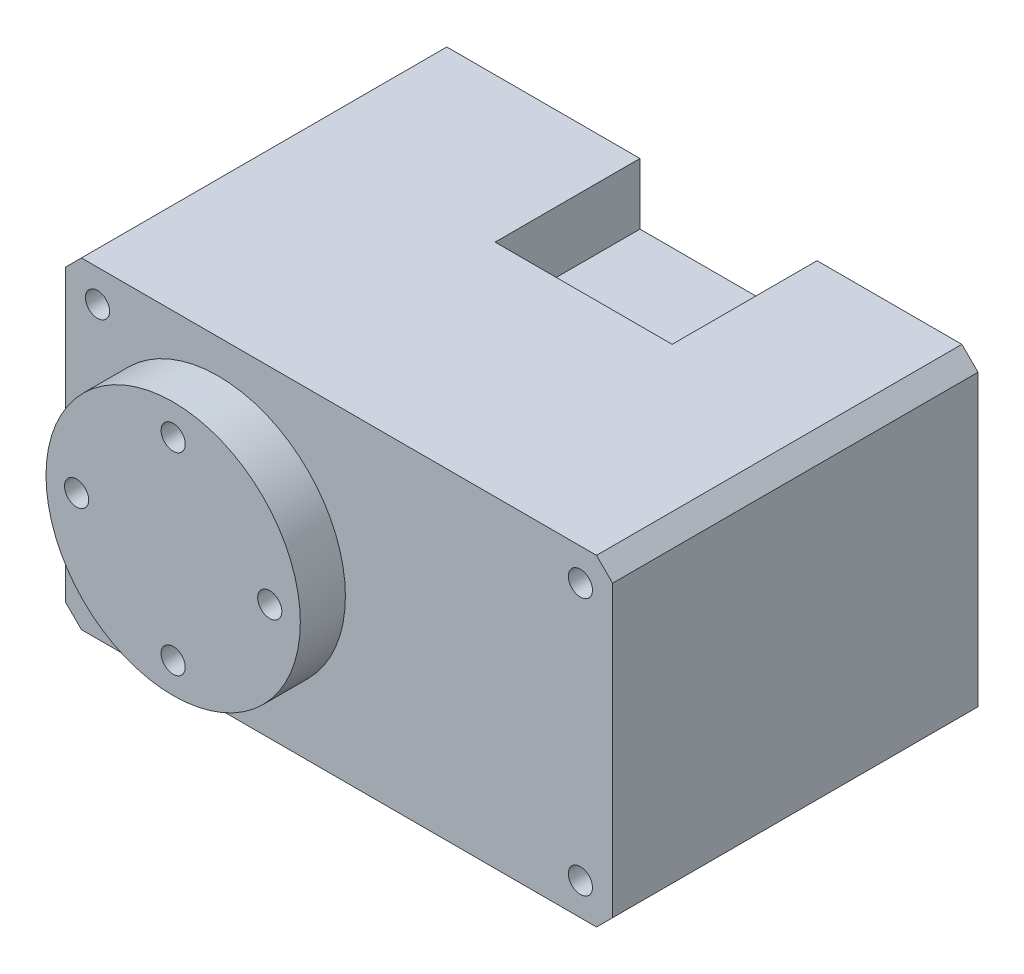
ISO-10303-21;
HEADER;
FILE_DESCRIPTION(('STEP AP214'),'2;1');
FILE_NAME('part.step','',(''),(''),'','','');
FILE_SCHEMA(('AUTOMOTIVE_DESIGN { 1 0 10303 214 1 1 1 1 }'));
ENDSEC;
DATA;
#1=APPLICATION_CONTEXT('core data for automotive mechanical design processes');
#2=APPLICATION_PROTOCOL_DEFINITION('international standard','automotive_design',2000,#1);
#3=PRODUCT_CONTEXT('',#1,'mechanical');
#4=PRODUCT('Part','Part','',(#3));
#5=PRODUCT_RELATED_PRODUCT_CATEGORY('part','',(#4));
#6=PRODUCT_DEFINITION_FORMATION('','',#4);
#7=PRODUCT_DEFINITION_CONTEXT('part definition',#1,'design');
#8=PRODUCT_DEFINITION('design','',#6,#7);
#9=PRODUCT_DEFINITION_SHAPE('','',#8);
#10=(LENGTH_UNIT() NAMED_UNIT(*) SI_UNIT(.MILLI.,.METRE.));
#11=(NAMED_UNIT(*) PLANE_ANGLE_UNIT() SI_UNIT($,.RADIAN.));
#12=(NAMED_UNIT(*) SI_UNIT($,.STERADIAN.) SOLID_ANGLE_UNIT());
#13=UNCERTAINTY_MEASURE_WITH_UNIT(LENGTH_MEASURE(1.E-05),#10,'distance_accuracy_value','');
#14=(GEOMETRIC_REPRESENTATION_CONTEXT(3) GLOBAL_UNCERTAINTY_ASSIGNED_CONTEXT((#13)) GLOBAL_UNIT_ASSIGNED_CONTEXT((#10,
#11,#12)) REPRESENTATION_CONTEXT('',''));
#15=CARTESIAN_POINT('',(0.,0.,0.));
#16=DIRECTION('',(0.,0.,1.));
#17=DIRECTION('',(1.,0.,0.));
#18=AXIS2_PLACEMENT_3D('',#15,#16,#17);
#19=CARTESIAN_POINT('',(0.,0.,19.5));
#20=DIRECTION('',(0.,0.,1.));
#21=DIRECTION('',(1.,0.,0.));
#22=AXIS2_PLACEMENT_3D('',#19,#20,#21);
#23=PLANE('',#22);
#24=CARTESIAN_POINT('',(-7.5,6.,19.5));
#25=DIRECTION('',(0.,0.,1.));
#26=DIRECTION('',(1.,0.,0.));
#27=AXIS2_PLACEMENT_3D('',#24,#25,#26);
#28=CIRCLE('',#27,0.75);
#29=CARTESIAN_POINT('',(-6.75,6.,19.5));
#30=VERTEX_POINT('',#29);
#31=EDGE_CURVE('E334',#30,#30,#28,.T.);
#32=ORIENTED_EDGE('',*,*,#31,.T.);
#33=EDGE_LOOP('',(#32));
#34=FACE_BOUND('',#33,.T.);
#35=ADVANCED_FACE('F38',(#34),#23,.T.);
#36=CARTESIAN_POINT('',(-7.5,7.5,19.5));
#37=DIRECTION('',(0.,0.,1.));
#38=DIRECTION('',(1.,0.,0.));
#39=AXIS2_PLACEMENT_3D('',#36,#37,#38);
#40=PLANE('',#39);
#41=CARTESIAN_POINT('',(-13.5,0.,19.5));
#42=DIRECTION('',(0.,0.,1.));
#43=DIRECTION('',(1.,0.,0.));
#44=AXIS2_PLACEMENT_3D('',#41,#42,#43);
#45=CIRCLE('',#44,0.75);
#46=CARTESIAN_POINT('',(-12.75,0.,19.5));
#47=VERTEX_POINT('',#46);
#48=EDGE_CURVE('E331',#47,#47,#45,.T.);
#49=ORIENTED_EDGE('',*,*,#48,.T.);
#50=EDGE_LOOP('',(#49));
#51=FACE_BOUND('',#50,.T.);
#52=ADVANCED_FACE('F573',(#51),#40,.T.);
#53=CARTESIAN_POINT('',(-15.,0.,19.5));
#54=DIRECTION('',(0.,0.,1.));
#55=DIRECTION('',(1.,0.,0.));
#56=AXIS2_PLACEMENT_3D('',#53,#54,#55);
#57=PLANE('',#56);
#58=CARTESIAN_POINT('',(-7.5,-6.,19.5));
#59=DIRECTION('',(0.,0.,1.));
#60=DIRECTION('',(1.,0.,0.));
#61=AXIS2_PLACEMENT_3D('',#58,#59,#60);
#62=CIRCLE('',#61,0.75);
#63=CARTESIAN_POINT('',(-6.75,-6.,19.5));
#64=VERTEX_POINT('',#63);
#65=EDGE_CURVE('E328',#64,#64,#62,.T.);
#66=ORIENTED_EDGE('',*,*,#65,.T.);
#67=EDGE_LOOP('',(#66));
#68=FACE_BOUND('',#67,.T.);
#69=ADVANCED_FACE('F577',(#68),#57,.T.);
#70=CARTESIAN_POINT('',(-7.5,-7.5,19.5));
#71=DIRECTION('',(0.,0.,1.));
#72=DIRECTION('',(1.,0.,0.));
#73=AXIS2_PLACEMENT_3D('',#70,#71,#72);
#74=PLANE('',#73);
#75=CARTESIAN_POINT('',(-1.5,0.,19.5));
#76=DIRECTION('',(0.,0.,1.));
#77=DIRECTION('',(1.,0.,0.));
#78=AXIS2_PLACEMENT_3D('',#75,#76,#77);
#79=CIRCLE('',#78,0.75);
#80=CARTESIAN_POINT('',(-0.75,0.,19.5));
#81=VERTEX_POINT('',#80);
#82=EDGE_CURVE('E325',#81,#81,#79,.T.);
#83=ORIENTED_EDGE('',*,*,#82,.T.);
#84=EDGE_LOOP('',(#83));
#85=FACE_BOUND('',#84,.T.);
#86=ADVANCED_FACE('F581',(#85),#74,.T.);
#87=CARTESIAN_POINT('',(-7.5,6.,25.5));
#88=DIRECTION('',(0.,0.,1.));
#89=DIRECTION('',(1.,0.,0.));
#90=AXIS2_PLACEMENT_3D('',#87,#88,#89);
#91=CYLINDRICAL_SURFACE('',#90,0.75);
#92=ORIENTED_EDGE('',*,*,#31,.F.);
#93=EDGE_LOOP('',(#92));
#94=FACE_BOUND('',#93,.T.);
#95=CARTESIAN_POINT('',(-7.5,6.,25.5));
#96=DIRECTION('',(0.,0.,1.));
#97=DIRECTION('',(1.,0.,0.));
#98=AXIS2_PLACEMENT_3D('',#95,#96,#97);
#99=CIRCLE('',#98,0.75);
#100=CARTESIAN_POINT('',(-6.75,6.,25.5));
#101=VERTEX_POINT('',#100);
#102=EDGE_CURVE('E322',#101,#101,#99,.F.);
#103=ORIENTED_EDGE('',*,*,#102,.F.);
#104=EDGE_LOOP('',(#103));
#105=FACE_BOUND('',#104,.T.);
#106=ADVANCED_FACE('F585',(#94,#105),#91,.F.);
#107=CARTESIAN_POINT('',(-13.5,0.,25.5));
#108=DIRECTION('',(0.,0.,1.));
#109=DIRECTION('',(1.,0.,0.));
#110=AXIS2_PLACEMENT_3D('',#107,#108,#109);
#111=CYLINDRICAL_SURFACE('',#110,0.75);
#112=ORIENTED_EDGE('',*,*,#48,.F.);
#113=EDGE_LOOP('',(#112));
#114=FACE_BOUND('',#113,.T.);
#115=CARTESIAN_POINT('',(-13.5,0.,25.5));
#116=DIRECTION('',(0.,0.,1.));
#117=DIRECTION('',(1.,0.,0.));
#118=AXIS2_PLACEMENT_3D('',#115,#116,#117);
#119=CIRCLE('',#118,0.75);
#120=CARTESIAN_POINT('',(-12.75,0.,25.5));
#121=VERTEX_POINT('',#120);
#122=EDGE_CURVE('E319',#121,#121,#119,.F.);
#123=ORIENTED_EDGE('',*,*,#122,.F.);
#124=EDGE_LOOP('',(#123));
#125=FACE_BOUND('',#124,.T.);
#126=ADVANCED_FACE('F589',(#114,#125),#111,.F.);
#127=CARTESIAN_POINT('',(-7.5,-6.,25.5));
#128=DIRECTION('',(0.,0.,1.));
#129=DIRECTION('',(1.,0.,0.));
#130=AXIS2_PLACEMENT_3D('',#127,#128,#129);
#131=CYLINDRICAL_SURFACE('',#130,0.75);
#132=ORIENTED_EDGE('',*,*,#65,.F.);
#133=EDGE_LOOP('',(#132));
#134=FACE_BOUND('',#133,.T.);
#135=CARTESIAN_POINT('',(-7.5,-6.,25.5));
#136=DIRECTION('',(0.,0.,1.));
#137=DIRECTION('',(1.,0.,0.));
#138=AXIS2_PLACEMENT_3D('',#135,#136,#137);
#139=CIRCLE('',#138,0.75);
#140=CARTESIAN_POINT('',(-6.75,-6.,25.5));
#141=VERTEX_POINT('',#140);
#142=EDGE_CURVE('E316',#141,#141,#139,.F.);
#143=ORIENTED_EDGE('',*,*,#142,.F.);
#144=EDGE_LOOP('',(#143));
#145=FACE_BOUND('',#144,.T.);
#146=ADVANCED_FACE('F593',(#134,#145),#131,.F.);
#147=CARTESIAN_POINT('',(-1.5,0.,25.5));
#148=DIRECTION('',(0.,0.,1.));
#149=DIRECTION('',(1.,0.,0.));
#150=AXIS2_PLACEMENT_3D('',#147,#148,#149);
#151=CYLINDRICAL_SURFACE('',#150,0.75);
#152=ORIENTED_EDGE('',*,*,#82,.F.);
#153=EDGE_LOOP('',(#152));
#154=FACE_BOUND('',#153,.T.);
#155=CARTESIAN_POINT('',(-1.5,0.,25.5));
#156=DIRECTION('',(0.,0.,1.));
#157=DIRECTION('',(1.,0.,0.));
#158=AXIS2_PLACEMENT_3D('',#155,#156,#157);
#159=CIRCLE('',#158,0.75);
#160=CARTESIAN_POINT('',(-0.75,0.,25.5));
#161=VERTEX_POINT('',#160);
#162=EDGE_CURVE('E313',#161,#161,#159,.F.);
#163=ORIENTED_EDGE('',*,*,#162,.F.);
#164=EDGE_LOOP('',(#163));
#165=FACE_BOUND('',#164,.T.);
#166=ADVANCED_FACE('F597',(#154,#165),#151,.F.);
#167=CARTESIAN_POINT('',(0.,0.,25.5));
#168=DIRECTION('',(0.,0.,1.));
#169=DIRECTION('',(1.,0.,0.));
#170=AXIS2_PLACEMENT_3D('',#167,#168,#169);
#171=PLANE('',#170);
#172=ORIENTED_EDGE('',*,*,#162,.T.);
#173=EDGE_LOOP('',(#172));
#174=FACE_BOUND('',#173,.T.);
#175=ORIENTED_EDGE('',*,*,#142,.T.);
#176=EDGE_LOOP('',(#175));
#177=FACE_BOUND('',#176,.T.);
#178=ORIENTED_EDGE('',*,*,#122,.T.);
#179=EDGE_LOOP('',(#178));
#180=FACE_BOUND('',#179,.T.);
#181=ORIENTED_EDGE('',*,*,#102,.T.);
#182=EDGE_LOOP('',(#181));
#183=FACE_BOUND('',#182,.T.);
#184=CARTESIAN_POINT('',(-7.5,0.,25.5));
#185=DIRECTION('',(0.,0.,1.));
#186=DIRECTION('',(1.,0.,0.));
#187=AXIS2_PLACEMENT_3D('',#184,#185,#186);
#188=CIRCLE('',#187,7.9);
#189=CARTESIAN_POINT('',(0.400000000000001,0.,25.5));
#190=VERTEX_POINT('',#189);
#191=EDGE_CURVE('E310',#190,#190,#188,.F.);
#192=ORIENTED_EDGE('',*,*,#191,.F.);
#193=EDGE_LOOP('',(#192));
#194=FACE_BOUND('',#193,.T.);
#195=ADVANCED_FACE('F601',(#174,#177,#180,#183,#194),#171,.T.);
#196=CARTESIAN_POINT('',(0.,0.,14.7));
#197=DIRECTION('',(0.,0.,1.));
#198=DIRECTION('',(1.,0.,0.));
#199=AXIS2_PLACEMENT_3D('',#196,#197,#198);
#200=PLANE('',#199);
#201=CARTESIAN_POINT('',(-15.,8.,14.7));
#202=DIRECTION('',(0.,0.,1.));
#203=DIRECTION('',(1.,0.,0.));
#204=AXIS2_PLACEMENT_3D('',#201,#202,#203);
#205=CIRCLE('',#204,0.75);
#206=CARTESIAN_POINT('',(-14.25,8.,14.7));
#207=VERTEX_POINT('',#206);
#208=EDGE_CURVE('E307',#207,#207,#205,.T.);
#209=ORIENTED_EDGE('',*,*,#208,.T.);
#210=EDGE_LOOP('',(#209));
#211=FACE_BOUND('',#210,.T.);
#212=ADVANCED_FACE('F605',(#211),#200,.T.);
#213=CARTESIAN_POINT('',(0.,0.,14.7));
#214=DIRECTION('',(0.,0.,1.));
#215=DIRECTION('',(1.,0.,0.));
#216=AXIS2_PLACEMENT_3D('',#213,#214,#215);
#217=PLANE('',#216);
#218=CARTESIAN_POINT('',(-15.,-8.,14.7));
#219=DIRECTION('',(0.,0.,1.));
#220=DIRECTION('',(1.,0.,0.));
#221=AXIS2_PLACEMENT_3D('',#218,#219,#220);
#222=CIRCLE('',#221,0.75);
#223=CARTESIAN_POINT('',(-14.25,-8.,14.7));
#224=VERTEX_POINT('',#223);
#225=EDGE_CURVE('E304',#224,#224,#222,.T.);
#226=ORIENTED_EDGE('',*,*,#225,.T.);
#227=EDGE_LOOP('',(#226));
#228=FACE_BOUND('',#227,.T.);
#229=ADVANCED_FACE('F609',(#228),#217,.T.);
#230=CARTESIAN_POINT('',(0.,0.,14.7));
#231=DIRECTION('',(0.,0.,1.));
#232=DIRECTION('',(1.,0.,0.));
#233=AXIS2_PLACEMENT_3D('',#230,#231,#232);
#234=PLANE('',#233);
#235=CARTESIAN_POINT('',(15.,8.,14.7));
#236=DIRECTION('',(0.,0.,1.));
#237=DIRECTION('',(1.,0.,0.));
#238=AXIS2_PLACEMENT_3D('',#235,#236,#237);
#239=CIRCLE('',#238,0.75);
#240=CARTESIAN_POINT('',(15.75,8.,14.7));
#241=VERTEX_POINT('',#240);
#242=EDGE_CURVE('E301',#241,#241,#239,.T.);
#243=ORIENTED_EDGE('',*,*,#242,.T.);
#244=EDGE_LOOP('',(#243));
#245=FACE_BOUND('',#244,.T.);
#246=ADVANCED_FACE('F613',(#245),#234,.T.);
#247=CARTESIAN_POINT('',(0.,0.,14.7));
#248=DIRECTION('',(0.,0.,1.));
#249=DIRECTION('',(1.,0.,0.));
#250=AXIS2_PLACEMENT_3D('',#247,#248,#249);
#251=PLANE('',#250);
#252=CARTESIAN_POINT('',(15.,-8.,14.7));
#253=DIRECTION('',(0.,0.,1.));
#254=DIRECTION('',(1.,0.,0.));
#255=AXIS2_PLACEMENT_3D('',#252,#253,#254);
#256=CIRCLE('',#255,0.75);
#257=CARTESIAN_POINT('',(15.75,-8.,14.7));
#258=VERTEX_POINT('',#257);
#259=EDGE_CURVE('E265',#258,#258,#256,.T.);
#260=ORIENTED_EDGE('',*,*,#259,.T.);
#261=EDGE_LOOP('',(#260));
#262=FACE_BOUND('',#261,.T.);
#263=ADVANCED_FACE('F617',(#262),#251,.T.);
#264=CARTESIAN_POINT('',(7.,-10.,9.));
#265=DIRECTION('',(0.,0.,1.));
#266=DIRECTION('',(1.,0.,0.));
#267=AXIS2_PLACEMENT_3D('',#264,#265,#266);
#268=PLANE('',#267);
#269=DIRECTION('',(1.,0.,0.));
#270=VECTOR('',#269,1.);
#271=CARTESIAN_POINT('',(0.,-6.2,9.));
#272=LINE('',#271,#270);
#273=CARTESIAN_POINT('',(7.,-6.2,9.));
#274=VERTEX_POINT('',#273);
#275=CARTESIAN_POINT('',(-4.,-6.2,9.));
#276=VERTEX_POINT('',#275);
#277=EDGE_CURVE('E260',#274,#276,#272,.F.);
#278=ORIENTED_EDGE('',*,*,#277,.F.);
#279=DIRECTION('',(0.,1.,0.));
#280=VECTOR('',#279,1.);
#281=CARTESIAN_POINT('',(7.,-10.,9.));
#282=LINE('',#281,#280);
#283=CARTESIAN_POINT('',(7.,-10.,9.));
#284=VERTEX_POINT('',#283);
#285=EDGE_CURVE('E252',#274,#284,#282,.F.);
#286=ORIENTED_EDGE('',*,*,#285,.T.);
#287=DIRECTION('',(1.,0.,0.));
#288=VECTOR('',#287,1.);
#289=CARTESIAN_POINT('',(-17.,-10.,9.));
#290=LINE('',#289,#288);
#291=CARTESIAN_POINT('',(-4.,-10.,9.));
#292=VERTEX_POINT('',#291);
#293=EDGE_CURVE('E246',#292,#284,#290,.T.);
#294=ORIENTED_EDGE('',*,*,#293,.F.);
#295=DIRECTION('',(0.,1.,0.));
#296=VECTOR('',#295,1.);
#297=CARTESIAN_POINT('',(-4.,-10.,9.));
#298=LINE('',#297,#296);
#299=EDGE_CURVE('E263',#292,#276,#298,.T.);
#300=ORIENTED_EDGE('',*,*,#299,.T.);
#301=EDGE_LOOP('',(#278,#286,#294,#300));
#302=FACE_BOUND('',#301,.T.);
#303=ADVANCED_FACE('F621',(#302),#268,.F.);
#304=CARTESIAN_POINT('',(0.,0.,6.));
#305=DIRECTION('',(0.,0.,-1.));
#306=DIRECTION('',(-1.,0.,0.));
#307=AXIS2_PLACEMENT_3D('',#304,#305,#306);
#308=PLANE('',#307);
#309=CARTESIAN_POINT('',(-15.,8.,6.));
#310=DIRECTION('',(0.,0.,-1.));
#311=DIRECTION('',(-1.,0.,0.));
#312=AXIS2_PLACEMENT_3D('',#309,#310,#311);
#313=CIRCLE('',#312,0.75);
#314=CARTESIAN_POINT('',(-15.75,8.,6.));
#315=VERTEX_POINT('',#314);
#316=EDGE_CURVE('E245',#315,#315,#313,.T.);
#317=ORIENTED_EDGE('',*,*,#316,.T.);
#318=EDGE_LOOP('',(#317));
#319=FACE_BOUND('',#318,.T.);
#320=ADVANCED_FACE('F625',(#319),#308,.T.);
#321=CARTESIAN_POINT('',(0.,0.,6.));
#322=DIRECTION('',(0.,0.,-1.));
#323=DIRECTION('',(-1.,0.,0.));
#324=AXIS2_PLACEMENT_3D('',#321,#322,#323);
#325=PLANE('',#324);
#326=CARTESIAN_POINT('',(15.,8.,6.));
#327=DIRECTION('',(0.,0.,-1.));
#328=DIRECTION('',(-1.,0.,0.));
#329=AXIS2_PLACEMENT_3D('',#326,#327,#328);
#330=CIRCLE('',#329,0.75);
#331=CARTESIAN_POINT('',(14.25,8.,6.));
#332=VERTEX_POINT('',#331);
#333=EDGE_CURVE('E294',#332,#332,#330,.T.);
#334=ORIENTED_EDGE('',*,*,#333,.T.);
#335=EDGE_LOOP('',(#334));
#336=FACE_BOUND('',#335,.T.);
#337=ADVANCED_FACE('F629',(#336),#325,.T.);
#338=CARTESIAN_POINT('',(0.,0.,6.));
#339=DIRECTION('',(0.,0.,-1.));
#340=DIRECTION('',(-1.,0.,0.));
#341=AXIS2_PLACEMENT_3D('',#338,#339,#340);
#342=PLANE('',#341);
#343=CARTESIAN_POINT('',(15.,-8.,6.));
#344=DIRECTION('',(0.,0.,-1.));
#345=DIRECTION('',(-1.,0.,0.));
#346=AXIS2_PLACEMENT_3D('',#343,#344,#345);
#347=CIRCLE('',#346,0.75);
#348=CARTESIAN_POINT('',(14.25,-8.,6.));
#349=VERTEX_POINT('',#348);
#350=EDGE_CURVE('E291',#349,#349,#347,.T.);
#351=ORIENTED_EDGE('',*,*,#350,.T.);
#352=EDGE_LOOP('',(#351));
#353=FACE_BOUND('',#352,.T.);
#354=ADVANCED_FACE('F633',(#353),#342,.T.);
#355=CARTESIAN_POINT('',(0.,0.,6.));
#356=DIRECTION('',(0.,0.,-1.));
#357=DIRECTION('',(-1.,0.,0.));
#358=AXIS2_PLACEMENT_3D('',#355,#356,#357);
#359=PLANE('',#358);
#360=CARTESIAN_POINT('',(-15.,-8.,6.));
#361=DIRECTION('',(0.,0.,-1.));
#362=DIRECTION('',(-1.,0.,0.));
#363=AXIS2_PLACEMENT_3D('',#360,#361,#362);
#364=CIRCLE('',#363,0.75);
#365=CARTESIAN_POINT('',(-15.75,-8.,6.));
#366=VERTEX_POINT('',#365);
#367=EDGE_CURVE('E241',#366,#366,#364,.T.);
#368=ORIENTED_EDGE('',*,*,#367,.T.);
#369=EDGE_LOOP('',(#368));
#370=FACE_BOUND('',#369,.T.);
#371=ADVANCED_FACE('F637',(#370),#359,.T.);
#372=CARTESIAN_POINT('',(-7.5,0.,22.7));
#373=DIRECTION('',(0.,0.,1.));
#374=DIRECTION('',(1.,0.,0.));
#375=AXIS2_PLACEMENT_3D('',#372,#373,#374);
#376=CYLINDRICAL_SURFACE('',#375,7.9);
#377=ORIENTED_EDGE('',*,*,#191,.T.);
#378=EDGE_LOOP('',(#377));
#379=FACE_BOUND('',#378,.T.);
#380=CARTESIAN_POINT('',(-7.5,0.,22.7));
#381=DIRECTION('',(0.,0.,1.));
#382=DIRECTION('',(1.,0.,0.));
#383=AXIS2_PLACEMENT_3D('',#380,#381,#382);
#384=CIRCLE('',#383,7.9);
#385=CARTESIAN_POINT('',(0.400000000000001,0.,22.7));
#386=VERTEX_POINT('',#385);
#387=EDGE_CURVE('E229',#386,#386,#384,.F.);
#388=ORIENTED_EDGE('',*,*,#387,.F.);
#389=EDGE_LOOP('',(#388));
#390=FACE_BOUND('',#389,.T.);
#391=ADVANCED_FACE('F641',(#379,#390),#376,.T.);
#392=CARTESIAN_POINT('',(-15.,8.,22.7));
#393=DIRECTION('',(0.,0.,1.));
#394=DIRECTION('',(1.,0.,0.));
#395=AXIS2_PLACEMENT_3D('',#392,#393,#394);
#396=CYLINDRICAL_SURFACE('',#395,0.75);
#397=ORIENTED_EDGE('',*,*,#208,.F.);
#398=EDGE_LOOP('',(#397));
#399=FACE_BOUND('',#398,.T.);
#400=CARTESIAN_POINT('',(-15.,8.,22.7));
#401=DIRECTION('',(0.,0.,1.));
#402=DIRECTION('',(1.,0.,0.));
#403=AXIS2_PLACEMENT_3D('',#400,#401,#402);
#404=CIRCLE('',#403,0.75);
#405=CARTESIAN_POINT('',(-14.25,8.,22.7));
#406=VERTEX_POINT('',#405);
#407=EDGE_CURVE('E284',#406,#406,#404,.F.);
#408=ORIENTED_EDGE('',*,*,#407,.F.);
#409=EDGE_LOOP('',(#408));
#410=FACE_BOUND('',#409,.T.);
#411=ADVANCED_FACE('F645',(#399,#410),#396,.F.);
#412=CARTESIAN_POINT('',(-15.,-8.,22.7));
#413=DIRECTION('',(0.,0.,1.));
#414=DIRECTION('',(1.,0.,0.));
#415=AXIS2_PLACEMENT_3D('',#412,#413,#414);
#416=CYLINDRICAL_SURFACE('',#415,0.75);
#417=ORIENTED_EDGE('',*,*,#225,.F.);
#418=EDGE_LOOP('',(#417));
#419=FACE_BOUND('',#418,.T.);
#420=CARTESIAN_POINT('',(-15.,-8.,22.7));
#421=DIRECTION('',(0.,0.,1.));
#422=DIRECTION('',(1.,0.,0.));
#423=AXIS2_PLACEMENT_3D('',#420,#421,#422);
#424=CIRCLE('',#423,0.75);
#425=CARTESIAN_POINT('',(-14.25,-8.,22.7));
#426=VERTEX_POINT('',#425);
#427=EDGE_CURVE('E281',#426,#426,#424,.F.);
#428=ORIENTED_EDGE('',*,*,#427,.F.);
#429=EDGE_LOOP('',(#428));
#430=FACE_BOUND('',#429,.T.);
#431=ADVANCED_FACE('F649',(#419,#430),#416,.F.);
#432=CARTESIAN_POINT('',(15.,8.,22.7));
#433=DIRECTION('',(0.,0.,1.));
#434=DIRECTION('',(1.,0.,0.));
#435=AXIS2_PLACEMENT_3D('',#432,#433,#434);
#436=CYLINDRICAL_SURFACE('',#435,0.75);
#437=ORIENTED_EDGE('',*,*,#242,.F.);
#438=EDGE_LOOP('',(#437));
#439=FACE_BOUND('',#438,.T.);
#440=CARTESIAN_POINT('',(15.,8.,22.7));
#441=DIRECTION('',(0.,0.,1.));
#442=DIRECTION('',(1.,0.,0.));
#443=AXIS2_PLACEMENT_3D('',#440,#441,#442);
#444=CIRCLE('',#443,0.75);
#445=CARTESIAN_POINT('',(15.75,8.,22.7));
#446=VERTEX_POINT('',#445);
#447=EDGE_CURVE('E278',#446,#446,#444,.F.);
#448=ORIENTED_EDGE('',*,*,#447,.F.);
#449=EDGE_LOOP('',(#448));
#450=FACE_BOUND('',#449,.T.);
#451=ADVANCED_FACE('F653',(#439,#450),#436,.F.);
#452=CARTESIAN_POINT('',(15.,-8.,22.7));
#453=DIRECTION('',(0.,0.,1.));
#454=DIRECTION('',(1.,0.,0.));
#455=AXIS2_PLACEMENT_3D('',#452,#453,#454);
#456=CYLINDRICAL_SURFACE('',#455,0.75);
#457=ORIENTED_EDGE('',*,*,#259,.F.);
#458=EDGE_LOOP('',(#457));
#459=FACE_BOUND('',#458,.T.);
#460=CARTESIAN_POINT('',(15.,-8.,22.7));
#461=DIRECTION('',(0.,0.,1.));
#462=DIRECTION('',(1.,0.,0.));
#463=AXIS2_PLACEMENT_3D('',#460,#461,#462);
#464=CIRCLE('',#463,0.75);
#465=CARTESIAN_POINT('',(15.75,-8.,22.7));
#466=VERTEX_POINT('',#465);
#467=EDGE_CURVE('E225',#466,#466,#464,.F.);
#468=ORIENTED_EDGE('',*,*,#467,.F.);
#469=EDGE_LOOP('',(#468));
#470=FACE_BOUND('',#469,.T.);
#471=ADVANCED_FACE('F657',(#459,#470),#456,.F.);
#472=CARTESIAN_POINT('',(-4.,-10.,9.));
#473=DIRECTION('',(-1.,0.,0.));
#474=DIRECTION('',(0.,0.,1.));
#475=AXIS2_PLACEMENT_3D('',#472,#473,#474);
#476=PLANE('',#475);
#477=ORIENTED_EDGE('',*,*,#299,.F.);
#478=DIRECTION('',(0.,0.,-1.));
#479=VECTOR('',#478,1.);
#480=CARTESIAN_POINT('',(-4.,-10.,0.));
#481=LINE('',#480,#479);
#482=CARTESIAN_POINT('',(-4.,-10.,0.));
#483=VERTEX_POINT('',#482);
#484=EDGE_CURVE('E249',#483,#292,#481,.F.);
#485=ORIENTED_EDGE('',*,*,#484,.F.);
#486=DIRECTION('',(0.,1.,0.));
#487=VECTOR('',#486,1.);
#488=CARTESIAN_POINT('',(-4.,0.,0.));
#489=LINE('',#488,#487);
#490=CARTESIAN_POINT('',(-4.,-6.2,0.));
#491=VERTEX_POINT('',#490);
#492=EDGE_CURVE('E212',#483,#491,#489,.T.);
#493=ORIENTED_EDGE('',*,*,#492,.T.);
#494=DIRECTION('',(0.,0.,-1.));
#495=VECTOR('',#494,1.);
#496=CARTESIAN_POINT('',(-4.,-6.2,0.));
#497=LINE('',#496,#495);
#498=EDGE_CURVE('E257',#276,#491,#497,.T.);
#499=ORIENTED_EDGE('',*,*,#498,.F.);
#500=EDGE_LOOP('',(#477,#485,#493,#499));
#501=FACE_BOUND('',#500,.T.);
#502=ADVANCED_FACE('F396',(#501),#476,.F.);
#503=CARTESIAN_POINT('',(0.,-6.2,0.));
#504=DIRECTION('',(0.,-1.,0.));
#505=DIRECTION('',(0.,0.,-1.));
#506=AXIS2_PLACEMENT_3D('',#503,#504,#505);
#507=PLANE('',#506);
#508=ORIENTED_EDGE('',*,*,#498,.T.);
#509=DIRECTION('',(1.,0.,0.));
#510=VECTOR('',#509,1.);
#511=CARTESIAN_POINT('',(0.,-6.2,0.));
#512=LINE('',#511,#510);
#513=CARTESIAN_POINT('',(7.,-6.2,0.));
#514=VERTEX_POINT('',#513);
#515=EDGE_CURVE('E210',#491,#514,#512,.T.);
#516=ORIENTED_EDGE('',*,*,#515,.T.);
#517=DIRECTION('',(0.,0.,-1.));
#518=VECTOR('',#517,1.);
#519=CARTESIAN_POINT('',(7.,-6.2,0.));
#520=LINE('',#519,#518);
#521=EDGE_CURVE('E254',#514,#274,#520,.F.);
#522=ORIENTED_EDGE('',*,*,#521,.T.);
#523=ORIENTED_EDGE('',*,*,#277,.T.);
#524=EDGE_LOOP('',(#508,#516,#522,#523));
#525=FACE_BOUND('',#524,.T.);
#526=ADVANCED_FACE('F393',(#525),#507,.T.);
#527=CARTESIAN_POINT('',(7.,-10.,0.));
#528=DIRECTION('',(1.,0.,0.));
#529=DIRECTION('',(0.,0.,-1.));
#530=AXIS2_PLACEMENT_3D('',#527,#528,#529);
#531=PLANE('',#530);
#532=ORIENTED_EDGE('',*,*,#285,.F.);
#533=ORIENTED_EDGE('',*,*,#521,.F.);
#534=DIRECTION('',(0.,1.,0.));
#535=VECTOR('',#534,1.);
#536=CARTESIAN_POINT('',(7.,0.,0.));
#537=LINE('',#536,#535);
#538=CARTESIAN_POINT('',(7.,-10.,0.));
#539=VERTEX_POINT('',#538);
#540=EDGE_CURVE('E208',#514,#539,#537,.F.);
#541=ORIENTED_EDGE('',*,*,#540,.T.);
#542=DIRECTION('',(0.,0.,-1.));
#543=VECTOR('',#542,1.);
#544=CARTESIAN_POINT('',(7.,-10.,0.));
#545=LINE('',#544,#543);
#546=EDGE_CURVE('E242',#284,#539,#545,.T.);
#547=ORIENTED_EDGE('',*,*,#546,.F.);
#548=EDGE_LOOP('',(#532,#533,#541,#547));
#549=FACE_BOUND('',#548,.T.);
#550=ADVANCED_FACE('F391',(#549),#531,.F.);
#551=CARTESIAN_POINT('',(-17.,-10.,0.));
#552=DIRECTION('',(0.,-1.,0.));
#553=DIRECTION('',(0.,0.,-1.));
#554=AXIS2_PLACEMENT_3D('',#551,#552,#553);
#555=PLANE('',#554);
#556=DIRECTION('',(1.,0.,0.));
#557=VECTOR('',#556,1.);
#558=CARTESIAN_POINT('',(0.,-10.,22.7));
#559=LINE('',#558,#557);
#560=CARTESIAN_POINT('',(-16.,-10.,22.7));
#561=VERTEX_POINT('',#560);
#562=CARTESIAN_POINT('',(16.,-10.,22.7));
#563=VERTEX_POINT('',#562);
#564=EDGE_CURVE('E230',#561,#563,#559,.T.);
#565=ORIENTED_EDGE('',*,*,#564,.F.);
#566=DIRECTION('',(0.,0.,-1.));
#567=VECTOR('',#566,1.);
#568=CARTESIAN_POINT('',(-16.,-10.,0.));
#569=LINE('',#568,#567);
#570=CARTESIAN_POINT('',(-16.,-10.,0.));
#571=VERTEX_POINT('',#570);
#572=EDGE_CURVE('E55',#561,#571,#569,.T.);
#573=ORIENTED_EDGE('',*,*,#572,.T.);
#574=DIRECTION('',(1.,0.,0.));
#575=VECTOR('',#574,1.);
#576=CARTESIAN_POINT('',(0.,-10.,0.));
#577=LINE('',#576,#575);
#578=EDGE_CURVE('E214',#571,#483,#577,.T.);
#579=ORIENTED_EDGE('',*,*,#578,.T.);
#580=ORIENTED_EDGE('',*,*,#484,.T.);
#581=ORIENTED_EDGE('',*,*,#293,.T.);
#582=ORIENTED_EDGE('',*,*,#546,.T.);
#583=DIRECTION('',(1.,0.,0.));
#584=VECTOR('',#583,1.);
#585=CARTESIAN_POINT('',(0.,-10.,0.));
#586=LINE('',#585,#584);
#587=CARTESIAN_POINT('',(16.,-10.,0.));
#588=VERTEX_POINT('',#587);
#589=EDGE_CURVE('E206',#539,#588,#586,.T.);
#590=ORIENTED_EDGE('',*,*,#589,.T.);
#591=DIRECTION('',(0.,0.,1.));
#592=VECTOR('',#591,1.);
#593=CARTESIAN_POINT('',(16.,-10.,0.));
#594=LINE('',#593,#592);
#595=EDGE_CURVE('E366',#588,#563,#594,.T.);
#596=ORIENTED_EDGE('',*,*,#595,.T.);
#597=EDGE_LOOP('',(#565,#573,#579,#580,#581,#582,#590,#596));
#598=FACE_BOUND('',#597,.T.);
#599=ADVANCED_FACE('F383',(#598),#555,.T.);
#600=CARTESIAN_POINT('',(-15.,8.,0.));
#601=DIRECTION('',(0.,0.,-1.));
#602=DIRECTION('',(-1.,0.,0.));
#603=AXIS2_PLACEMENT_3D('',#600,#601,#602);
#604=CYLINDRICAL_SURFACE('',#603,0.75);
#605=ORIENTED_EDGE('',*,*,#316,.F.);
#606=EDGE_LOOP('',(#605));
#607=FACE_BOUND('',#606,.T.);
#608=CARTESIAN_POINT('',(-15.,8.,0.));
#609=DIRECTION('',(0.,0.,-1.));
#610=DIRECTION('',(-1.,0.,0.));
#611=AXIS2_PLACEMENT_3D('',#608,#609,#610);
#612=CIRCLE('',#611,0.75);
#613=CARTESIAN_POINT('',(-15.75,8.,0.));
#614=VERTEX_POINT('',#613);
#615=EDGE_CURVE('E205',#614,#614,#612,.T.);
#616=ORIENTED_EDGE('',*,*,#615,.T.);
#617=EDGE_LOOP('',(#616));
#618=FACE_BOUND('',#617,.T.);
#619=ADVANCED_FACE('F669',(#607,#618),#604,.F.);
#620=CARTESIAN_POINT('',(15.,8.,0.));
#621=DIRECTION('',(0.,0.,-1.));
#622=DIRECTION('',(-1.,0.,0.));
#623=AXIS2_PLACEMENT_3D('',#620,#621,#622);
#624=CYLINDRICAL_SURFACE('',#623,0.75);
#625=ORIENTED_EDGE('',*,*,#333,.F.);
#626=EDGE_LOOP('',(#625));
#627=FACE_BOUND('',#626,.T.);
#628=CARTESIAN_POINT('',(15.,8.,0.));
#629=DIRECTION('',(0.,0.,-1.));
#630=DIRECTION('',(-1.,0.,0.));
#631=AXIS2_PLACEMENT_3D('',#628,#629,#630);
#632=CIRCLE('',#631,0.75);
#633=CARTESIAN_POINT('',(14.25,8.,0.));
#634=VERTEX_POINT('',#633);
#635=EDGE_CURVE('E271',#634,#634,#632,.T.);
#636=ORIENTED_EDGE('',*,*,#635,.T.);
#637=EDGE_LOOP('',(#636));
#638=FACE_BOUND('',#637,.T.);
#639=ADVANCED_FACE('F672',(#627,#638),#624,.F.);
#640=CARTESIAN_POINT('',(15.,-8.,0.));
#641=DIRECTION('',(0.,0.,-1.));
#642=DIRECTION('',(-1.,0.,0.));
#643=AXIS2_PLACEMENT_3D('',#640,#641,#642);
#644=CYLINDRICAL_SURFACE('',#643,0.75);
#645=ORIENTED_EDGE('',*,*,#350,.F.);
#646=EDGE_LOOP('',(#645));
#647=FACE_BOUND('',#646,.T.);
#648=CARTESIAN_POINT('',(15.,-8.,0.));
#649=DIRECTION('',(0.,0.,-1.));
#650=DIRECTION('',(-1.,0.,0.));
#651=AXIS2_PLACEMENT_3D('',#648,#649,#650);
#652=CIRCLE('',#651,0.75);
#653=CARTESIAN_POINT('',(14.25,-8.,0.));
#654=VERTEX_POINT('',#653);
#655=EDGE_CURVE('E268',#654,#654,#652,.T.);
#656=ORIENTED_EDGE('',*,*,#655,.T.);
#657=EDGE_LOOP('',(#656));
#658=FACE_BOUND('',#657,.T.);
#659=ADVANCED_FACE('F676',(#647,#658),#644,.F.);
#660=CARTESIAN_POINT('',(-15.,-8.,0.));
#661=DIRECTION('',(0.,0.,-1.));
#662=DIRECTION('',(-1.,0.,0.));
#663=AXIS2_PLACEMENT_3D('',#660,#661,#662);
#664=CYLINDRICAL_SURFACE('',#663,0.75);
#665=ORIENTED_EDGE('',*,*,#367,.F.);
#666=EDGE_LOOP('',(#665));
#667=FACE_BOUND('',#666,.T.);
#668=CARTESIAN_POINT('',(-15.,-8.,0.));
#669=DIRECTION('',(0.,0.,-1.));
#670=DIRECTION('',(-1.,0.,0.));
#671=AXIS2_PLACEMENT_3D('',#668,#669,#670);
#672=CIRCLE('',#671,0.75);
#673=CARTESIAN_POINT('',(-15.75,-8.,0.));
#674=VERTEX_POINT('',#673);
#675=EDGE_CURVE('E201',#674,#674,#672,.T.);
#676=ORIENTED_EDGE('',*,*,#675,.T.);
#677=EDGE_LOOP('',(#676));
#678=FACE_BOUND('',#677,.T.);
#679=ADVANCED_FACE('F428',(#667,#678),#664,.F.);
#680=CARTESIAN_POINT('',(0.,6.2,0.));
#681=DIRECTION('',(0.,-1.,0.));
#682=DIRECTION('',(0.,0.,-1.));
#683=AXIS2_PLACEMENT_3D('',#680,#681,#682);
#684=PLANE('',#683);
#685=DIRECTION('',(0.,0.,-1.));
#686=VECTOR('',#685,1.);
#687=CARTESIAN_POINT('',(-4.,6.2,9.));
#688=LINE('',#687,#686);
#689=CARTESIAN_POINT('',(-4.,6.2,9.));
#690=VERTEX_POINT('',#689);
#691=CARTESIAN_POINT('',(-4.,6.2,0.));
#692=VERTEX_POINT('',#691);
#693=EDGE_CURVE('E233',#690,#692,#688,.T.);
#694=ORIENTED_EDGE('',*,*,#693,.F.);
#695=DIRECTION('',(-1.,0.,0.));
#696=VECTOR('',#695,1.);
#697=CARTESIAN_POINT('',(7.,6.2,9.));
#698=LINE('',#697,#696);
#699=CARTESIAN_POINT('',(7.,6.2,9.));
#700=VERTEX_POINT('',#699);
#701=EDGE_CURVE('E239',#700,#690,#698,.T.);
#702=ORIENTED_EDGE('',*,*,#701,.F.);
#703=DIRECTION('',(0.,0.,1.));
#704=VECTOR('',#703,1.);
#705=CARTESIAN_POINT('',(7.,6.2,0.));
#706=LINE('',#705,#704);
#707=CARTESIAN_POINT('',(7.,6.2,0.));
#708=VERTEX_POINT('',#707);
#709=EDGE_CURVE('E176',#708,#700,#706,.T.);
#710=ORIENTED_EDGE('',*,*,#709,.F.);
#711=DIRECTION('',(1.,0.,0.));
#712=VECTOR('',#711,1.);
#713=CARTESIAN_POINT('',(0.,6.2,0.));
#714=LINE('',#713,#712);
#715=EDGE_CURVE('E172',#708,#692,#714,.F.);
#716=ORIENTED_EDGE('',*,*,#715,.T.);
#717=EDGE_LOOP('',(#694,#702,#710,#716));
#718=FACE_BOUND('',#717,.T.);
#719=ADVANCED_FACE('F417',(#718),#684,.F.);
#720=CARTESIAN_POINT('',(7.,10.,9.));
#721=DIRECTION('',(0.,0.,-1.));
#722=DIRECTION('',(-1.,0.,0.));
#723=AXIS2_PLACEMENT_3D('',#720,#721,#722);
#724=PLANE('',#723);
#725=DIRECTION('',(1.,0.,0.));
#726=VECTOR('',#725,1.);
#727=CARTESIAN_POINT('',(17.,10.,9.));
#728=LINE('',#727,#726);
#729=CARTESIAN_POINT('',(7.,10.,9.));
#730=VERTEX_POINT('',#729);
#731=CARTESIAN_POINT('',(-4.,10.,9.));
#732=VERTEX_POINT('',#731);
#733=EDGE_CURVE('E197',#730,#732,#728,.F.);
#734=ORIENTED_EDGE('',*,*,#733,.F.);
#735=DIRECTION('',(0.,1.,0.));
#736=VECTOR('',#735,1.);
#737=CARTESIAN_POINT('',(7.,10.,9.));
#738=LINE('',#737,#736);
#739=EDGE_CURVE('E177',#700,#730,#738,.T.);
#740=ORIENTED_EDGE('',*,*,#739,.F.);
#741=ORIENTED_EDGE('',*,*,#701,.T.);
#742=DIRECTION('',(0.,1.,0.));
#743=VECTOR('',#742,1.);
#744=CARTESIAN_POINT('',(-4.,10.,9.));
#745=LINE('',#744,#743);
#746=EDGE_CURVE('E236',#732,#690,#745,.F.);
#747=ORIENTED_EDGE('',*,*,#746,.F.);
#748=EDGE_LOOP('',(#734,#740,#741,#747));
#749=FACE_BOUND('',#748,.T.);
#750=ADVANCED_FACE('F419',(#749),#724,.T.);
#751=CARTESIAN_POINT('',(-4.,10.,9.));
#752=DIRECTION('',(1.,0.,0.));
#753=DIRECTION('',(0.,0.,-1.));
#754=AXIS2_PLACEMENT_3D('',#751,#752,#753);
#755=PLANE('',#754);
#756=ORIENTED_EDGE('',*,*,#746,.T.);
#757=ORIENTED_EDGE('',*,*,#693,.T.);
#758=DIRECTION('',(0.,1.,0.));
#759=VECTOR('',#758,1.);
#760=CARTESIAN_POINT('',(-4.,0.,0.));
#761=LINE('',#760,#759);
#762=CARTESIAN_POINT('',(-4.,10.,0.));
#763=VERTEX_POINT('',#762);
#764=EDGE_CURVE('E219',#692,#763,#761,.T.);
#765=ORIENTED_EDGE('',*,*,#764,.T.);
#766=DIRECTION('',(0.,0.,1.));
#767=VECTOR('',#766,1.);
#768=CARTESIAN_POINT('',(-4.,10.,0.));
#769=LINE('',#768,#767);
#770=EDGE_CURVE('E194',#732,#763,#769,.F.);
#771=ORIENTED_EDGE('',*,*,#770,.F.);
#772=EDGE_LOOP('',(#756,#757,#765,#771));
#773=FACE_BOUND('',#772,.T.);
#774=ADVANCED_FACE('F414',(#773),#755,.T.);
#775=CARTESIAN_POINT('',(-17.,10.,0.));
#776=DIRECTION('',(-1.,0.,0.));
#777=DIRECTION('',(0.,0.,1.));
#778=AXIS2_PLACEMENT_3D('',#775,#776,#777);
#779=PLANE('',#778);
#780=DIRECTION('',(0.,1.,0.));
#781=VECTOR('',#780,1.);
#782=CARTESIAN_POINT('',(-17.,0.,22.7));
#783=LINE('',#782,#781);
#784=CARTESIAN_POINT('',(-17.,9.,22.7));
#785=VERTEX_POINT('',#784);
#786=CARTESIAN_POINT('',(-17.,-8.99999999999999,22.7));
#787=VERTEX_POINT('',#786);
#788=EDGE_CURVE('E226',#785,#787,#783,.F.);
#789=ORIENTED_EDGE('',*,*,#788,.F.);
#790=DIRECTION('',(0.,0.,-1.));
#791=VECTOR('',#790,1.);
#792=CARTESIAN_POINT('',(-17.,9.,0.));
#793=LINE('',#792,#791);
#794=CARTESIAN_POINT('',(-17.,9.,0.));
#795=VERTEX_POINT('',#794);
#796=EDGE_CURVE('E357',#785,#795,#793,.T.);
#797=ORIENTED_EDGE('',*,*,#796,.T.);
#798=DIRECTION('',(0.,1.,0.));
#799=VECTOR('',#798,1.);
#800=CARTESIAN_POINT('',(-17.,0.,0.));
#801=LINE('',#800,#799);
#802=CARTESIAN_POINT('',(-17.,-8.99999999999999,0.));
#803=VERTEX_POINT('',#802);
#804=EDGE_CURVE('E216',#795,#803,#801,.F.);
#805=ORIENTED_EDGE('',*,*,#804,.T.);
#806=DIRECTION('',(0.,0.,1.));
#807=VECTOR('',#806,1.);
#808=CARTESIAN_POINT('',(-17.,-8.99999999999999,0.));
#809=LINE('',#808,#807);
#810=EDGE_CURVE('E354',#803,#787,#809,.T.);
#811=ORIENTED_EDGE('',*,*,#810,.T.);
#812=EDGE_LOOP('',(#789,#797,#805,#811));
#813=FACE_BOUND('',#812,.T.);
#814=ADVANCED_FACE('F405',(#813),#779,.T.);
#815=CARTESIAN_POINT('',(0.,0.,22.7));
#816=DIRECTION('',(0.,0.,1.));
#817=DIRECTION('',(1.,0.,0.));
#818=AXIS2_PLACEMENT_3D('',#815,#816,#817);
#819=PLANE('',#818);
#820=ORIENTED_EDGE('',*,*,#467,.T.);
#821=EDGE_LOOP('',(#820));
#822=FACE_BOUND('',#821,.T.);
#823=ORIENTED_EDGE('',*,*,#447,.T.);
#824=EDGE_LOOP('',(#823));
#825=FACE_BOUND('',#824,.T.);
#826=ORIENTED_EDGE('',*,*,#427,.T.);
#827=EDGE_LOOP('',(#826));
#828=FACE_BOUND('',#827,.T.);
#829=ORIENTED_EDGE('',*,*,#407,.T.);
#830=EDGE_LOOP('',(#829));
#831=FACE_BOUND('',#830,.T.);
#832=ORIENTED_EDGE('',*,*,#387,.T.);
#833=EDGE_LOOP('',(#832));
#834=FACE_BOUND('',#833,.T.);
#835=DIRECTION('',(1.,0.,0.));
#836=VECTOR('',#835,1.);
#837=CARTESIAN_POINT('',(17.,10.,22.7));
#838=LINE('',#837,#836);
#839=CARTESIAN_POINT('',(-16.,10.,22.7));
#840=VERTEX_POINT('',#839);
#841=CARTESIAN_POINT('',(16.,10.,22.7));
#842=VERTEX_POINT('',#841);
#843=EDGE_CURVE('E165',#840,#842,#838,.T.);
#844=ORIENTED_EDGE('',*,*,#843,.F.);
#845=DIRECTION('',(0.707106781186548,0.707106781186548,0.));
#846=VECTOR('',#845,1.);
#847=CARTESIAN_POINT('',(-13.,13.,22.7));
#848=LINE('',#847,#846);
#849=EDGE_CURVE('E352',#840,#785,#848,.F.);
#850=ORIENTED_EDGE('',*,*,#849,.T.);
#851=ORIENTED_EDGE('',*,*,#788,.T.);
#852=DIRECTION('',(-0.707106781186548,0.707106781186548,0.));
#853=VECTOR('',#852,1.);
#854=CARTESIAN_POINT('',(-13.,-13.,22.7));
#855=LINE('',#854,#853);
#856=EDGE_CURVE('E350',#787,#561,#855,.F.);
#857=ORIENTED_EDGE('',*,*,#856,.T.);
#858=ORIENTED_EDGE('',*,*,#564,.T.);
#859=DIRECTION('',(-0.707106781186548,-0.707106781186548,0.));
#860=VECTOR('',#859,1.);
#861=CARTESIAN_POINT('',(13.,-13.,22.7));
#862=LINE('',#861,#860);
#863=CARTESIAN_POINT('',(17.,-8.99999999999999,22.7));
#864=VERTEX_POINT('',#863);
#865=EDGE_CURVE('E346',#563,#864,#862,.F.);
#866=ORIENTED_EDGE('',*,*,#865,.T.);
#867=DIRECTION('',(0.,1.,0.));
#868=VECTOR('',#867,1.);
#869=CARTESIAN_POINT('',(17.,-10.,22.7));
#870=LINE('',#869,#868);
#871=CARTESIAN_POINT('',(17.,9.,22.7));
#872=VERTEX_POINT('',#871);
#873=EDGE_CURVE('E222',#872,#864,#870,.F.);
#874=ORIENTED_EDGE('',*,*,#873,.F.);
#875=DIRECTION('',(0.707106781186548,-0.707106781186548,0.));
#876=VECTOR('',#875,1.);
#877=CARTESIAN_POINT('',(13.,13.,22.7));
#878=LINE('',#877,#876);
#879=EDGE_CURVE('E348',#872,#842,#878,.F.);
#880=ORIENTED_EDGE('',*,*,#879,.T.);
#881=EDGE_LOOP('',(#844,#850,#851,#857,#858,#866,#874,#880));
#882=FACE_BOUND('',#881,.T.);
#883=ADVANCED_FACE('F381',(#822,#825,#828,#831,#834,#882),#819,.T.);
#884=CARTESIAN_POINT('',(17.,-10.,0.));
#885=DIRECTION('',(1.,0.,0.));
#886=DIRECTION('',(0.,0.,-1.));
#887=AXIS2_PLACEMENT_3D('',#884,#885,#886);
#888=PLANE('',#887);
#889=DIRECTION('',(0.,1.,0.));
#890=VECTOR('',#889,1.);
#891=CARTESIAN_POINT('',(17.,0.,0.));
#892=LINE('',#891,#890);
#893=CARTESIAN_POINT('',(17.,-8.99999999999999,0.));
#894=VERTEX_POINT('',#893);
#895=CARTESIAN_POINT('',(17.,9.,0.));
#896=VERTEX_POINT('',#895);
#897=EDGE_CURVE('E202',#894,#896,#892,.T.);
#898=ORIENTED_EDGE('',*,*,#897,.T.);
#899=DIRECTION('',(0.,0.,1.));
#900=VECTOR('',#899,1.);
#901=CARTESIAN_POINT('',(17.,9.,0.));
#902=LINE('',#901,#900);
#903=EDGE_CURVE('E11',#896,#872,#902,.T.);
#904=ORIENTED_EDGE('',*,*,#903,.T.);
#905=ORIENTED_EDGE('',*,*,#873,.T.);
#906=DIRECTION('',(0.,0.,-1.));
#907=VECTOR('',#906,1.);
#908=CARTESIAN_POINT('',(17.,-8.99999999999999,0.));
#909=LINE('',#908,#907);
#910=EDGE_CURVE('E48',#864,#894,#909,.T.);
#911=ORIENTED_EDGE('',*,*,#910,.T.);
#912=EDGE_LOOP('',(#898,#904,#905,#911));
#913=FACE_BOUND('',#912,.T.);
#914=ADVANCED_FACE('F371',(#913),#888,.T.);
#915=CARTESIAN_POINT('',(0.,0.,0.));
#916=DIRECTION('',(0.,0.,1.));
#917=DIRECTION('',(1.,0.,0.));
#918=AXIS2_PLACEMENT_3D('',#915,#916,#917);
#919=PLANE('',#918);
#920=CARTESIAN_POINT('',(-7.5,0.,0.));
#921=DIRECTION('',(0.,0.,1.));
#922=DIRECTION('',(1.,0.,0.));
#923=AXIS2_PLACEMENT_3D('',#920,#921,#922);
#924=CIRCLE('',#923,2.5);
#925=CARTESIAN_POINT('',(-5.,0.,0.));
#926=VERTEX_POINT('',#925);
#927=EDGE_CURVE('E185',#926,#926,#924,.F.);
#928=ORIENTED_EDGE('',*,*,#927,.F.);
#929=EDGE_LOOP('',(#928));
#930=FACE_BOUND('',#929,.T.);
#931=ORIENTED_EDGE('',*,*,#675,.F.);
#932=EDGE_LOOP('',(#931));
#933=FACE_BOUND('',#932,.T.);
#934=ORIENTED_EDGE('',*,*,#655,.F.);
#935=EDGE_LOOP('',(#934));
#936=FACE_BOUND('',#935,.T.);
#937=ORIENTED_EDGE('',*,*,#635,.F.);
#938=EDGE_LOOP('',(#937));
#939=FACE_BOUND('',#938,.T.);
#940=ORIENTED_EDGE('',*,*,#615,.F.);
#941=EDGE_LOOP('',(#940));
#942=FACE_BOUND('',#941,.T.);
#943=ORIENTED_EDGE('',*,*,#804,.F.);
#944=DIRECTION('',(-0.707106781186548,-0.707106781186548,0.));
#945=VECTOR('',#944,1.);
#946=CARTESIAN_POINT('',(-16.,10.,0.));
#947=LINE('',#946,#945);
#948=CARTESIAN_POINT('',(-16.,10.,0.));
#949=VERTEX_POINT('',#948);
#950=EDGE_CURVE('E364',#795,#949,#947,.F.);
#951=ORIENTED_EDGE('',*,*,#950,.T.);
#952=DIRECTION('',(1.,0.,0.));
#953=VECTOR('',#952,1.);
#954=CARTESIAN_POINT('',(17.,10.,0.));
#955=LINE('',#954,#953);
#956=EDGE_CURVE('E192',#763,#949,#955,.F.);
#957=ORIENTED_EDGE('',*,*,#956,.F.);
#958=ORIENTED_EDGE('',*,*,#764,.F.);
#959=ORIENTED_EDGE('',*,*,#715,.F.);
#960=DIRECTION('',(0.,1.,0.));
#961=VECTOR('',#960,1.);
#962=CARTESIAN_POINT('',(7.,10.,0.));
#963=LINE('',#962,#961);
#964=CARTESIAN_POINT('',(7.,10.,0.));
#965=VERTEX_POINT('',#964);
#966=EDGE_CURVE('E168',#965,#708,#963,.F.);
#967=ORIENTED_EDGE('',*,*,#966,.F.);
#968=DIRECTION('',(1.,0.,0.));
#969=VECTOR('',#968,1.);
#970=CARTESIAN_POINT('',(17.,10.,0.));
#971=LINE('',#970,#969);
#972=CARTESIAN_POINT('',(16.,10.,0.));
#973=VERTEX_POINT('',#972);
#974=EDGE_CURVE('E155',#973,#965,#971,.F.);
#975=ORIENTED_EDGE('',*,*,#974,.F.);
#976=DIRECTION('',(-0.707106781186548,0.707106781186548,0.));
#977=VECTOR('',#976,1.);
#978=CARTESIAN_POINT('',(16.,10.,0.));
#979=LINE('',#978,#977);
#980=EDGE_CURVE('E360',#973,#896,#979,.F.);
#981=ORIENTED_EDGE('',*,*,#980,.T.);
#982=ORIENTED_EDGE('',*,*,#897,.F.);
#983=DIRECTION('',(0.707106781186548,0.707106781186548,0.));
#984=VECTOR('',#983,1.);
#985=CARTESIAN_POINT('',(17.,-8.99999999999999,0.));
#986=LINE('',#985,#984);
#987=EDGE_CURVE('E63',#894,#588,#986,.F.);
#988=ORIENTED_EDGE('',*,*,#987,.T.);
#989=ORIENTED_EDGE('',*,*,#589,.F.);
#990=ORIENTED_EDGE('',*,*,#540,.F.);
#991=ORIENTED_EDGE('',*,*,#515,.F.);
#992=ORIENTED_EDGE('',*,*,#492,.F.);
#993=ORIENTED_EDGE('',*,*,#578,.F.);
#994=DIRECTION('',(0.707106781186548,-0.707106781186548,0.));
#995=VECTOR('',#994,1.);
#996=CARTESIAN_POINT('',(-17.,-8.99999999999999,0.));
#997=LINE('',#996,#995);
#998=EDGE_CURVE('E362',#571,#803,#997,.F.);
#999=ORIENTED_EDGE('',*,*,#998,.T.);
#1000=EDGE_LOOP('',(#943,#951,#957,#958,#959,#967,#975,#981,#982,#988,#989,#990,#991,#992,#993,#999));
#1001=FACE_BOUND('',#1000,.T.);
#1002=ADVANCED_FACE('F170',(#930,#933,#936,#939,#942,#1001),#919,.F.);
#1003=CARTESIAN_POINT('',(7.,10.,0.));
#1004=DIRECTION('',(-1.,0.,0.));
#1005=DIRECTION('',(0.,0.,1.));
#1006=AXIS2_PLACEMENT_3D('',#1003,#1004,#1005);
#1007=PLANE('',#1006);
#1008=ORIENTED_EDGE('',*,*,#966,.T.);
#1009=ORIENTED_EDGE('',*,*,#709,.T.);
#1010=ORIENTED_EDGE('',*,*,#739,.T.);
#1011=DIRECTION('',(0.,0.,1.));
#1012=VECTOR('',#1011,1.);
#1013=CARTESIAN_POINT('',(7.,10.,0.));
#1014=LINE('',#1013,#1012);
#1015=EDGE_CURVE('E161',#965,#730,#1014,.T.);
#1016=ORIENTED_EDGE('',*,*,#1015,.F.);
#1017=EDGE_LOOP('',(#1008,#1009,#1010,#1016));
#1018=FACE_BOUND('',#1017,.T.);
#1019=ADVANCED_FACE('F180',(#1018),#1007,.T.);
#1020=CARTESIAN_POINT('',(17.,10.,0.));
#1021=DIRECTION('',(0.,1.,0.));
#1022=DIRECTION('',(0.,0.,1.));
#1023=AXIS2_PLACEMENT_3D('',#1020,#1021,#1022);
#1024=PLANE('',#1023);
#1025=ORIENTED_EDGE('',*,*,#956,.T.);
#1026=DIRECTION('',(0.,0.,1.));
#1027=VECTOR('',#1026,1.);
#1028=CARTESIAN_POINT('',(-16.,10.,0.));
#1029=LINE('',#1028,#1027);
#1030=EDGE_CURVE('E343',#949,#840,#1029,.T.);
#1031=ORIENTED_EDGE('',*,*,#1030,.T.);
#1032=ORIENTED_EDGE('',*,*,#843,.T.);
#1033=DIRECTION('',(0.,0.,-1.));
#1034=VECTOR('',#1033,1.);
#1035=CARTESIAN_POINT('',(16.,10.,0.));
#1036=LINE('',#1035,#1034);
#1037=EDGE_CURVE('E164',#842,#973,#1036,.T.);
#1038=ORIENTED_EDGE('',*,*,#1037,.T.);
#1039=ORIENTED_EDGE('',*,*,#974,.T.);
#1040=ORIENTED_EDGE('',*,*,#1015,.T.);
#1041=ORIENTED_EDGE('',*,*,#733,.T.);
#1042=ORIENTED_EDGE('',*,*,#770,.T.);
#1043=EDGE_LOOP('',(#1025,#1031,#1032,#1038,#1039,#1040,#1041,#1042));
#1044=FACE_BOUND('',#1043,.T.);
#1045=ADVANCED_FACE('F158',(#1044),#1024,.T.);
#1046=CARTESIAN_POINT('',(-7.5,0.,-2.5));
#1047=DIRECTION('',(0.,0.,1.));
#1048=DIRECTION('',(1.,0.,0.));
#1049=AXIS2_PLACEMENT_3D('',#1046,#1047,#1048);
#1050=CYLINDRICAL_SURFACE('',#1049,2.5);
#1051=CARTESIAN_POINT('',(-7.5,0.,-2.5));
#1052=DIRECTION('',(0.,0.,-1.));
#1053=DIRECTION('',(-1.,0.,0.));
#1054=AXIS2_PLACEMENT_3D('',#1051,#1052,#1053);
#1055=CIRCLE('',#1054,2.5);
#1056=CARTESIAN_POINT('',(-10.,0.,-2.5));
#1057=VERTEX_POINT('',#1056);
#1058=EDGE_CURVE('E188',#1057,#1057,#1055,.T.);
#1059=ORIENTED_EDGE('',*,*,#1058,.F.);
#1060=EDGE_LOOP('',(#1059));
#1061=FACE_BOUND('',#1060,.T.);
#1062=ORIENTED_EDGE('',*,*,#927,.T.);
#1063=EDGE_LOOP('',(#1062));
#1064=FACE_BOUND('',#1063,.T.);
#1065=ADVANCED_FACE('F431',(#1061,#1064),#1050,.T.);
#1066=CARTESIAN_POINT('',(-7.5,0.,-2.5));
#1067=DIRECTION('',(0.,0.,-1.));
#1068=DIRECTION('',(-1.,0.,0.));
#1069=AXIS2_PLACEMENT_3D('',#1066,#1067,#1068);
#1070=PLANE('',#1069);
#1071=CARTESIAN_POINT('',(-7.5,0.,-2.5));
#1072=DIRECTION('',(0.,0.,-1.));
#1073=DIRECTION('',(-1.,0.,0.));
#1074=AXIS2_PLACEMENT_3D('',#1071,#1072,#1073);
#1075=CIRCLE('',#1074,1.);
#1076=CARTESIAN_POINT('',(-8.5,0.,-2.5));
#1077=VERTEX_POINT('',#1076);
#1078=EDGE_CURVE('E967',#1077,#1077,#1075,.T.);
#1079=ORIENTED_EDGE('',*,*,#1078,.F.);
#1080=EDGE_LOOP('',(#1079));
#1081=FACE_BOUND('',#1080,.T.);
#1082=ORIENTED_EDGE('',*,*,#1058,.T.);
#1083=EDGE_LOOP('',(#1082));
#1084=FACE_BOUND('',#1083,.T.);
#1085=ADVANCED_FACE('F438',(#1081,#1084),#1070,.T.);
#1086=CARTESIAN_POINT('',(-7.5,0.,5.5));
#1087=DIRECTION('',(0.,0.,-1.));
#1088=DIRECTION('',(-1.,0.,0.));
#1089=AXIS2_PLACEMENT_3D('',#1086,#1087,#1088);
#1090=CYLINDRICAL_SURFACE('',#1089,1.);
#1091=CARTESIAN_POINT('',(-7.5,0.,5.5));
#1092=DIRECTION('',(0.,0.,-1.));
#1093=DIRECTION('',(-1.,0.,0.));
#1094=AXIS2_PLACEMENT_3D('',#1091,#1092,#1093);
#1095=CIRCLE('',#1094,1.);
#1096=CARTESIAN_POINT('',(-8.5,0.,5.5));
#1097=VERTEX_POINT('',#1096);
#1098=EDGE_CURVE('E966',#1097,#1097,#1095,.T.);
#1099=ORIENTED_EDGE('',*,*,#1098,.F.);
#1100=EDGE_LOOP('',(#1099));
#1101=FACE_BOUND('',#1100,.T.);
#1102=ORIENTED_EDGE('',*,*,#1078,.T.);
#1103=EDGE_LOOP('',(#1102));
#1104=FACE_BOUND('',#1103,.T.);
#1105=ADVANCED_FACE('F498',(#1101,#1104),#1090,.F.);
#1106=CARTESIAN_POINT('',(-7.5,0.,5.5));
#1107=DIRECTION('',(0.,0.,-1.));
#1108=DIRECTION('',(-1.,0.,0.));
#1109=AXIS2_PLACEMENT_3D('',#1106,#1107,#1108);
#1110=PLANE('',#1109);
#1111=ORIENTED_EDGE('',*,*,#1098,.T.);
#1112=EDGE_LOOP('',(#1111));
#1113=FACE_BOUND('',#1112,.T.);
#1114=ADVANCED_FACE('F505',(#1113),#1110,.T.);
#1115=CARTESIAN_POINT('',(-16.,10.,0.));
#1116=DIRECTION('',(0.707106781186547,-0.707106781186547,0.));
#1117=DIRECTION('',(0.,0.,1.));
#1118=AXIS2_PLACEMENT_3D('',#1115,#1116,#1117);
#1119=PLANE('',#1118);
#1120=ORIENTED_EDGE('',*,*,#950,.F.);
#1121=ORIENTED_EDGE('',*,*,#796,.F.);
#1122=ORIENTED_EDGE('',*,*,#849,.F.);
#1123=ORIENTED_EDGE('',*,*,#1030,.F.);
#1124=EDGE_LOOP('',(#1120,#1121,#1122,#1123));
#1125=FACE_BOUND('',#1124,.T.);
#1126=ADVANCED_FACE('F410',(#1125),#1119,.F.);
#1127=CARTESIAN_POINT('',(-17.,-8.99999999999999,0.));
#1128=DIRECTION('',(0.707106781186547,0.707106781186547,0.));
#1129=DIRECTION('',(0.,0.,1.));
#1130=AXIS2_PLACEMENT_3D('',#1127,#1128,#1129);
#1131=PLANE('',#1130);
#1132=ORIENTED_EDGE('',*,*,#998,.F.);
#1133=ORIENTED_EDGE('',*,*,#572,.F.);
#1134=ORIENTED_EDGE('',*,*,#856,.F.);
#1135=ORIENTED_EDGE('',*,*,#810,.F.);
#1136=EDGE_LOOP('',(#1132,#1133,#1134,#1135));
#1137=FACE_BOUND('',#1136,.T.);
#1138=ADVANCED_FACE('F402',(#1137),#1131,.F.);
#1139=CARTESIAN_POINT('',(16.,10.,0.));
#1140=DIRECTION('',(-0.707106781186547,-0.707106781186547,0.));
#1141=DIRECTION('',(0.,0.,-1.));
#1142=AXIS2_PLACEMENT_3D('',#1139,#1140,#1141);
#1143=PLANE('',#1142);
#1144=ORIENTED_EDGE('',*,*,#879,.F.);
#1145=ORIENTED_EDGE('',*,*,#903,.F.);
#1146=ORIENTED_EDGE('',*,*,#980,.F.);
#1147=ORIENTED_EDGE('',*,*,#1037,.F.);
#1148=EDGE_LOOP('',(#1144,#1145,#1146,#1147));
#1149=FACE_BOUND('',#1148,.T.);
#1150=ADVANCED_FACE('F378',(#1149),#1143,.F.);
#1151=CARTESIAN_POINT('',(17.,-8.99999999999999,0.));
#1152=DIRECTION('',(-0.707106781186547,0.707106781186547,0.));
#1153=DIRECTION('',(0.,0.,-1.));
#1154=AXIS2_PLACEMENT_3D('',#1151,#1152,#1153);
#1155=PLANE('',#1154);
#1156=ORIENTED_EDGE('',*,*,#865,.F.);
#1157=ORIENTED_EDGE('',*,*,#595,.F.);
#1158=ORIENTED_EDGE('',*,*,#987,.F.);
#1159=ORIENTED_EDGE('',*,*,#910,.F.);
#1160=EDGE_LOOP('',(#1156,#1157,#1158,#1159));
#1161=FACE_BOUND('',#1160,.T.);
#1162=ADVANCED_FACE('F41',(#1161),#1155,.F.);
#1163=CLOSED_SHELL('',(#35,#52,#69,#86,#106,#126,#146,#166,#195,#212,#229,#246,#263,#303,#320,
#337,#354,#371,#391,#411,#431,#451,#471,#502,#526,#550,#599,#619,#639,#659,#679,#719,#750,#774,
#814,#883,#914,#1002,#1019,#1045,#1065,#1085,#1105,#1114,#1126,#1138,#1150,#1162));
#1164=CARTESIAN_POINT('',(-7.5,0.,8.));
#1165=DIRECTION('',(0.,0.,-1.));
#1166=DIRECTION('',(-1.,0.,0.));
#1167=AXIS2_PLACEMENT_3D('',#1164,#1165,#1166);
#1168=PLANE('',#1167);
#1169=CARTESIAN_POINT('',(-7.5,0.,8.));
#1170=DIRECTION('',(0.,0.,-1.));
#1171=DIRECTION('',(-1.,0.,0.));
#1172=AXIS2_PLACEMENT_3D('',#1169,#1170,#1171);
#1173=CIRCLE('',#1172,1.);
#1174=CARTESIAN_POINT('',(-8.5,0.,8.));
#1175=VERTEX_POINT('',#1174);
#1176=EDGE_CURVE('E182',#1175,#1175,#1173,.F.);
#1177=ORIENTED_EDGE('',*,*,#1176,.T.);
#1178=EDGE_LOOP('',(#1177));
#1179=FACE_BOUND('',#1178,.T.);
#1180=ADVANCED_FACE('F444',(#1179),#1168,.F.);
#1181=CARTESIAN_POINT('',(0.,0.,11.1));
#1182=DIRECTION('',(0.,0.,-1.));
#1183=DIRECTION('',(-1.,0.,0.));
#1184=AXIS2_PLACEMENT_3D('',#1181,#1182,#1183);
#1185=PLANE('',#1184);
#1186=CARTESIAN_POINT('',(-7.5,0.,11.1));
#1187=DIRECTION('',(0.,0.,-1.));
#1188=DIRECTION('',(-1.,0.,0.));
#1189=AXIS2_PLACEMENT_3D('',#1186,#1187,#1188);
#1190=CIRCLE('',#1189,1.);
#1191=CARTESIAN_POINT('',(-8.5,0.,11.1));
#1192=VERTEX_POINT('',#1191);
#1193=EDGE_CURVE('E337',#1192,#1192,#1190,.T.);
#1194=ORIENTED_EDGE('',*,*,#1193,.T.);
#1195=EDGE_LOOP('',(#1194));
#1196=FACE_BOUND('',#1195,.T.);
#1197=ADVANCED_FACE('F518',(#1196),#1185,.T.);
#1198=CARTESIAN_POINT('',(-7.5,0.,3.1));
#1199=DIRECTION('',(0.,0.,-1.));
#1200=DIRECTION('',(-1.,0.,0.));
#1201=AXIS2_PLACEMENT_3D('',#1198,#1199,#1200);
#1202=CYLINDRICAL_SURFACE('',#1201,1.);
#1203=ORIENTED_EDGE('',*,*,#1193,.F.);
#1204=EDGE_LOOP('',(#1203));
#1205=FACE_BOUND('',#1204,.T.);
#1206=ORIENTED_EDGE('',*,*,#1176,.F.);
#1207=EDGE_LOOP('',(#1206));
#1208=FACE_BOUND('',#1207,.T.);
#1209=ADVANCED_FACE('F483',(#1205,#1208),#1202,.F.);
#1210=CLOSED_SHELL('',(#1180,#1197,#1209));
#1211=ORIENTED_CLOSED_SHELL('',*,#1210,.T.);
#1212=BREP_WITH_VOIDS('B2',#1163,(#1211));
#1213=ADVANCED_BREP_SHAPE_REPRESENTATION('',(#18,#1212),#14);
#1214=SHAPE_DEFINITION_REPRESENTATION(#9,#1213);
ENDSEC;
END-ISO-10303-21;
